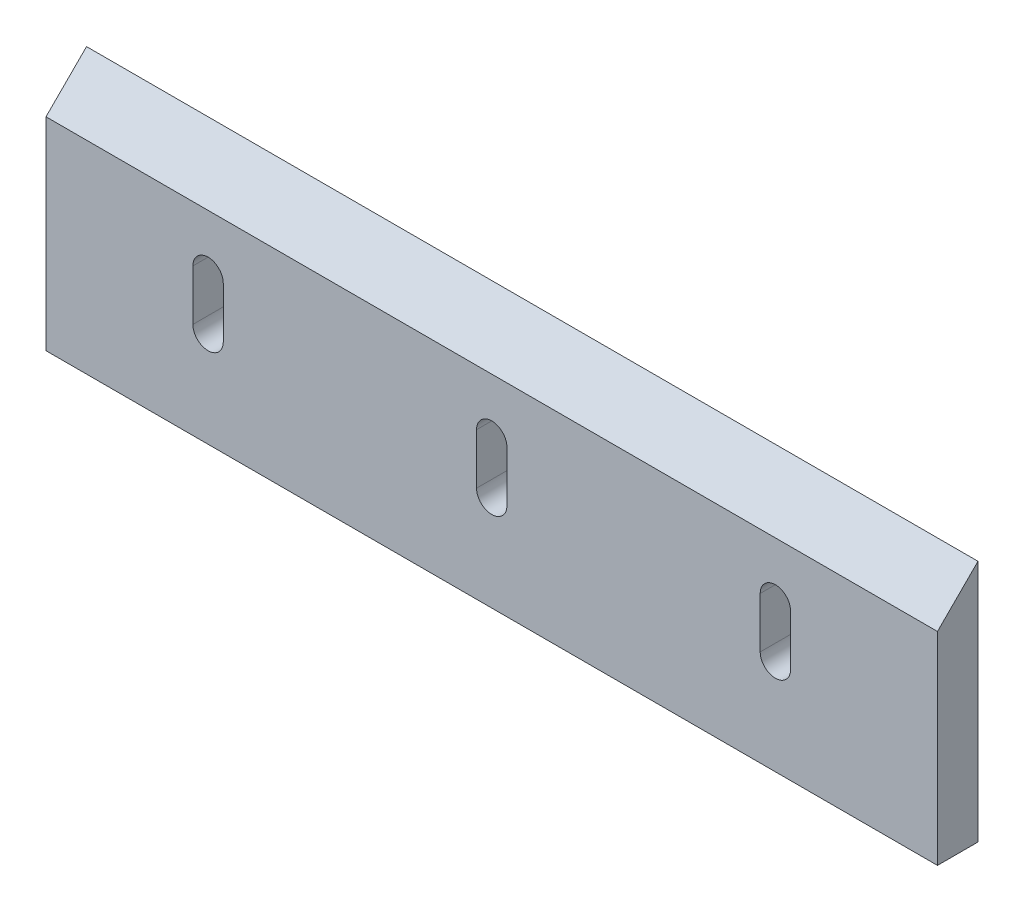
ISO-10303-21;
HEADER;
FILE_DESCRIPTION(('STEP AP214'),'2;1');
FILE_NAME('part.step','',(''),(''),'','','');
FILE_SCHEMA(('AUTOMOTIVE_DESIGN { 1 0 10303 214 1 1 1 1 }'));
ENDSEC;
DATA;
#1=APPLICATION_CONTEXT('core data for automotive mechanical design processes');
#2=APPLICATION_PROTOCOL_DEFINITION('international standard','automotive_design',2000,#1);
#3=PRODUCT_CONTEXT('',#1,'mechanical');
#4=PRODUCT('Part','Part','',(#3));
#5=PRODUCT_RELATED_PRODUCT_CATEGORY('part','',(#4));
#6=PRODUCT_DEFINITION_FORMATION('','',#4);
#7=PRODUCT_DEFINITION_CONTEXT('part definition',#1,'design');
#8=PRODUCT_DEFINITION('design','',#6,#7);
#9=PRODUCT_DEFINITION_SHAPE('','',#8);
#10=(LENGTH_UNIT() NAMED_UNIT(*) SI_UNIT(.MILLI.,.METRE.));
#11=(NAMED_UNIT(*) PLANE_ANGLE_UNIT() SI_UNIT($,.RADIAN.));
#12=(NAMED_UNIT(*) SI_UNIT($,.STERADIAN.) SOLID_ANGLE_UNIT());
#13=UNCERTAINTY_MEASURE_WITH_UNIT(LENGTH_MEASURE(1.E-05),#10,'distance_accuracy_value','');
#14=(GEOMETRIC_REPRESENTATION_CONTEXT(3) GLOBAL_UNCERTAINTY_ASSIGNED_CONTEXT((#13)) GLOBAL_UNIT_ASSIGNED_CONTEXT((#10,
#11,#12)) REPRESENTATION_CONTEXT('',''));
#15=CARTESIAN_POINT('',(0.,0.,0.));
#16=DIRECTION('',(0.,0.,1.));
#17=DIRECTION('',(1.,0.,0.));
#18=AXIS2_PLACEMENT_3D('',#15,#16,#17);
#19=CARTESIAN_POINT('',(139.7,-38.1,6.34999999999997));
#20=DIRECTION('',(-1.,0.,0.));
#21=DIRECTION('',(0.,0.,1.));
#22=AXIS2_PLACEMENT_3D('',#19,#20,#21);
#23=PLANE('',#22);
#24=DIRECTION('',(0.,1.,0.));
#25=VECTOR('',#24,1.);
#26=CARTESIAN_POINT('',(139.7,-38.0999999999999,-6.35000000000008));
#27=LINE('',#26,#25);
#28=CARTESIAN_POINT('',(139.7,-38.0999999999999,-6.35000000000008));
#29=VERTEX_POINT('',#28);
#30=CARTESIAN_POINT('',(139.7,38.1,-6.35000000000008));
#31=VERTEX_POINT('',#30);
#32=EDGE_CURVE('E260',#29,#31,#27,.T.);
#33=ORIENTED_EDGE('',*,*,#32,.T.);
#34=DIRECTION('',(0.,0.707106781186546,-0.707106781186549));
#35=VECTOR('',#34,1.);
#36=CARTESIAN_POINT('',(139.7,38.1,-6.35000000000008));
#37=LINE('',#36,#35);
#38=CARTESIAN_POINT('',(139.7,25.4000000000001,6.34999999999997));
#39=VERTEX_POINT('',#38);
#40=EDGE_CURVE('E253',#39,#31,#37,.T.);
#41=ORIENTED_EDGE('',*,*,#40,.F.);
#42=DIRECTION('',(0.,1.,0.));
#43=VECTOR('',#42,1.);
#44=CARTESIAN_POINT('',(139.7,-38.1,6.34999999999997));
#45=LINE('',#44,#43);
#46=CARTESIAN_POINT('',(139.7,-38.1,6.34999999999997));
#47=VERTEX_POINT('',#46);
#48=EDGE_CURVE('E261',#47,#39,#45,.T.);
#49=ORIENTED_EDGE('',*,*,#48,.F.);
#50=DIRECTION('',(0.,0.,-1.));
#51=VECTOR('',#50,1.);
#52=CARTESIAN_POINT('',(139.7,-38.1,6.34999999999997));
#53=LINE('',#52,#51);
#54=EDGE_CURVE('E269',#47,#29,#53,.T.);
#55=ORIENTED_EDGE('',*,*,#54,.T.);
#56=EDGE_LOOP('',(#33,#41,#49,#55));
#57=FACE_BOUND('',#56,.T.);
#58=ADVANCED_FACE('F34',(#57),#23,.F.);
#59=CARTESIAN_POINT('',(-139.7,-38.1,6.35000000000008));
#60=DIRECTION('',(1.,0.,0.));
#61=DIRECTION('',(0.,0.,-1.));
#62=AXIS2_PLACEMENT_3D('',#59,#60,#61);
#63=PLANE('',#62);
#64=DIRECTION('',(0.,-1.,0.));
#65=VECTOR('',#64,1.);
#66=CARTESIAN_POINT('',(-139.7,-38.1,6.35000000000008));
#67=LINE('',#66,#65);
#68=CARTESIAN_POINT('',(-139.7,25.4000000000001,6.35000000000008));
#69=VERTEX_POINT('',#68);
#70=CARTESIAN_POINT('',(-139.7,-38.1,6.35000000000008));
#71=VERTEX_POINT('',#70);
#72=EDGE_CURVE('E264',#69,#71,#67,.T.);
#73=ORIENTED_EDGE('',*,*,#72,.F.);
#74=DIRECTION('',(0.,0.707106781186546,-0.707106781186549));
#75=VECTOR('',#74,1.);
#76=CARTESIAN_POINT('',(-139.7,38.1000000000001,-6.34999999999997));
#77=LINE('',#76,#75);
#78=CARTESIAN_POINT('',(-139.7,38.1000000000001,-6.34999999999997));
#79=VERTEX_POINT('',#78);
#80=EDGE_CURVE('E254',#69,#79,#77,.T.);
#81=ORIENTED_EDGE('',*,*,#80,.T.);
#82=DIRECTION('',(0.,-1.,0.));
#83=VECTOR('',#82,1.);
#84=CARTESIAN_POINT('',(-139.7,-38.0999999999999,-6.34999999999997));
#85=LINE('',#84,#83);
#86=CARTESIAN_POINT('',(-139.7,-38.0999999999999,-6.34999999999997));
#87=VERTEX_POINT('',#86);
#88=EDGE_CURVE('E274',#79,#87,#85,.T.);
#89=ORIENTED_EDGE('',*,*,#88,.T.);
#90=DIRECTION('',(0.,0.,-1.));
#91=VECTOR('',#90,1.);
#92=CARTESIAN_POINT('',(-139.7,-38.1,6.35000000000008));
#93=LINE('',#92,#91);
#94=EDGE_CURVE('E156',#71,#87,#93,.T.);
#95=ORIENTED_EDGE('',*,*,#94,.F.);
#96=EDGE_LOOP('',(#73,#81,#89,#95));
#97=FACE_BOUND('',#96,.T.);
#98=ADVANCED_FACE('F307',(#97),#63,.F.);
#99=CARTESIAN_POINT('',(-139.7,-38.1,6.35000000000008));
#100=DIRECTION('',(0.,1.,0.));
#101=DIRECTION('',(0.,0.,1.));
#102=AXIS2_PLACEMENT_3D('',#99,#100,#101);
#103=PLANE('',#102);
#104=DIRECTION('',(1.,0.,0.));
#105=VECTOR('',#104,1.);
#106=CARTESIAN_POINT('',(-139.7,-38.0999999999999,-6.34999999999997));
#107=LINE('',#106,#105);
#108=EDGE_CURVE('E265',#87,#29,#107,.T.);
#109=ORIENTED_EDGE('',*,*,#108,.T.);
#110=ORIENTED_EDGE('',*,*,#54,.F.);
#111=DIRECTION('',(1.,0.,0.));
#112=VECTOR('',#111,1.);
#113=CARTESIAN_POINT('',(-139.7,-38.1,6.35000000000008));
#114=LINE('',#113,#112);
#115=EDGE_CURVE('E267',#71,#47,#114,.T.);
#116=ORIENTED_EDGE('',*,*,#115,.F.);
#117=ORIENTED_EDGE('',*,*,#94,.T.);
#118=EDGE_LOOP('',(#109,#110,#116,#117));
#119=FACE_BOUND('',#118,.T.);
#120=ADVANCED_FACE('F289',(#119),#103,.F.);
#121=CARTESIAN_POINT('',(1.11022302462516E-13,0.,6.34999999999997));
#122=DIRECTION('',(0.,0.,-1.));
#123=DIRECTION('',(-1.,0.,0.));
#124=AXIS2_PLACEMENT_3D('',#121,#122,#123);
#125=PLANE('',#124);
#126=DIRECTION('',(0.,-1.,0.));
#127=VECTOR('',#126,1.);
#128=CARTESIAN_POINT('',(-84.1374999999999,0.,6.34999999999997));
#129=LINE('',#128,#127);
#130=CARTESIAN_POINT('',(-84.1375,7.93749999999877,6.35000000000008));
#131=VERTEX_POINT('',#130);
#132=CARTESIAN_POINT('',(-84.1375,-7.93750000000126,6.34999999999997));
#133=VERTEX_POINT('',#132);
#134=EDGE_CURVE('E247',#131,#133,#129,.T.);
#135=ORIENTED_EDGE('',*,*,#134,.T.);
#136=CARTESIAN_POINT('',(-88.9,-7.93750000000126,6.35000000000008));
#137=DIRECTION('',(0.,0.,-1.));
#138=DIRECTION('',(-1.,0.,0.));
#139=AXIS2_PLACEMENT_3D('',#136,#137,#138);
#140=CIRCLE('',#139,4.7625);
#141=CARTESIAN_POINT('',(-93.6625,-7.93750000000126,6.35000000000008));
#142=VERTEX_POINT('',#141);
#143=EDGE_CURVE('E215',#133,#142,#140,.T.);
#144=ORIENTED_EDGE('',*,*,#143,.T.);
#145=DIRECTION('',(0.,1.,0.));
#146=VECTOR('',#145,1.);
#147=CARTESIAN_POINT('',(-93.6624999999999,0.,6.34999999999997));
#148=LINE('',#147,#146);
#149=CARTESIAN_POINT('',(-93.6625,7.93749999999877,6.35000000000008));
#150=VERTEX_POINT('',#149);
#151=EDGE_CURVE('E250',#142,#150,#148,.T.);
#152=ORIENTED_EDGE('',*,*,#151,.T.);
#153=CARTESIAN_POINT('',(-88.9,7.93749999999877,6.35000000000019));
#154=DIRECTION('',(0.,0.,-1.));
#155=DIRECTION('',(-1.,0.,0.));
#156=AXIS2_PLACEMENT_3D('',#153,#154,#155);
#157=CIRCLE('',#156,4.7625);
#158=EDGE_CURVE('E207',#150,#131,#157,.T.);
#159=ORIENTED_EDGE('',*,*,#158,.T.);
#160=EDGE_LOOP('',(#135,#144,#152,#159));
#161=FACE_BOUND('',#160,.T.);
#162=DIRECTION('',(0.,-1.,0.));
#163=VECTOR('',#162,1.);
#164=CARTESIAN_POINT('',(93.6624999999999,0.,6.35000000000019));
#165=LINE('',#164,#163);
#166=CARTESIAN_POINT('',(93.6624999999999,7.93749999999999,6.35000000000008));
#167=VERTEX_POINT('',#166);
#168=CARTESIAN_POINT('',(93.6624999999999,-7.93749999999999,6.35000000000008));
#169=VERTEX_POINT('',#168);
#170=EDGE_CURVE('E235',#167,#169,#165,.T.);
#171=ORIENTED_EDGE('',*,*,#170,.T.);
#172=CARTESIAN_POINT('',(88.8999999999999,-7.93749999999999,6.35000000000008));
#173=DIRECTION('',(0.,0.,-1.));
#174=DIRECTION('',(-1.,0.,0.));
#175=AXIS2_PLACEMENT_3D('',#172,#173,#174);
#176=CIRCLE('',#175,4.7625);
#177=CARTESIAN_POINT('',(84.1374999999999,-7.93749999999999,6.35000000000008));
#178=VERTEX_POINT('',#177);
#179=EDGE_CURVE('E244',#169,#178,#176,.T.);
#180=ORIENTED_EDGE('',*,*,#179,.T.);
#181=DIRECTION('',(0.,1.,0.));
#182=VECTOR('',#181,1.);
#183=CARTESIAN_POINT('',(84.1374999999999,0.,6.35000000000008));
#184=LINE('',#183,#182);
#185=CARTESIAN_POINT('',(84.1374999999999,7.93749999999999,6.35000000000019));
#186=VERTEX_POINT('',#185);
#187=EDGE_CURVE('E241',#178,#186,#184,.T.);
#188=ORIENTED_EDGE('',*,*,#187,.T.);
#189=CARTESIAN_POINT('',(88.8999999999999,7.93749999999999,6.35000000000019));
#190=DIRECTION('',(0.,0.,-1.));
#191=DIRECTION('',(-1.,0.,0.));
#192=AXIS2_PLACEMENT_3D('',#189,#190,#191);
#193=CIRCLE('',#192,4.7625);
#194=EDGE_CURVE('E238',#186,#167,#193,.T.);
#195=ORIENTED_EDGE('',*,*,#194,.T.);
#196=EDGE_LOOP('',(#171,#180,#188,#195));
#197=FACE_BOUND('',#196,.T.);
#198=DIRECTION('',(0.,-1.,0.));
#199=VECTOR('',#198,1.);
#200=CARTESIAN_POINT('',(4.76250000000011,0.,6.34999999999997));
#201=LINE('',#200,#199);
#202=CARTESIAN_POINT('',(4.7625,7.93749999999938,6.34999999999997));
#203=VERTEX_POINT('',#202);
#204=CARTESIAN_POINT('',(4.7625,-7.9375000000006,6.35000000000008));
#205=VERTEX_POINT('',#204);
#206=EDGE_CURVE('E222',#203,#205,#201,.T.);
#207=ORIENTED_EDGE('',*,*,#206,.T.);
#208=CARTESIAN_POINT('',(0.,-7.9375000000006,6.34999999999997));
#209=DIRECTION('',(0.,0.,-1.));
#210=DIRECTION('',(-1.,0.,0.));
#211=AXIS2_PLACEMENT_3D('',#208,#209,#210);
#212=CIRCLE('',#211,4.7625);
#213=CARTESIAN_POINT('',(-4.7625,-7.9375000000006,6.34999999999997));
#214=VERTEX_POINT('',#213);
#215=EDGE_CURVE('E164',#205,#214,#212,.T.);
#216=ORIENTED_EDGE('',*,*,#215,.T.);
#217=DIRECTION('',(0.,1.,0.));
#218=VECTOR('',#217,1.);
#219=CARTESIAN_POINT('',(-4.76249999999989,0.,6.34999999999997));
#220=LINE('',#219,#218);
#221=CARTESIAN_POINT('',(-4.7625,7.93749999999938,6.34999999999997));
#222=VERTEX_POINT('',#221);
#223=EDGE_CURVE('E231',#214,#222,#220,.T.);
#224=ORIENTED_EDGE('',*,*,#223,.T.);
#225=CARTESIAN_POINT('',(0.,7.93749999999938,6.34999999999997));
#226=DIRECTION('',(0.,0.,-1.));
#227=DIRECTION('',(-1.,0.,0.));
#228=AXIS2_PLACEMENT_3D('',#225,#226,#227);
#229=CIRCLE('',#228,4.7625);
#230=EDGE_CURVE('E228',#222,#203,#229,.T.);
#231=ORIENTED_EDGE('',*,*,#230,.T.);
#232=EDGE_LOOP('',(#207,#216,#224,#231));
#233=FACE_BOUND('',#232,.T.);
#234=ORIENTED_EDGE('',*,*,#48,.T.);
#235=DIRECTION('',(1.,0.,0.));
#236=VECTOR('',#235,1.);
#237=CARTESIAN_POINT('',(-139.7,25.4000000000001,6.35000000000008));
#238=LINE('',#237,#236);
#239=EDGE_CURVE('E257',#69,#39,#238,.T.);
#240=ORIENTED_EDGE('',*,*,#239,.F.);
#241=ORIENTED_EDGE('',*,*,#72,.T.);
#242=ORIENTED_EDGE('',*,*,#115,.T.);
#243=EDGE_LOOP('',(#234,#240,#241,#242));
#244=FACE_BOUND('',#243,.T.);
#245=ADVANCED_FACE('F286',(#161,#197,#233,#244),#125,.F.);
#246=CARTESIAN_POINT('',(-1.11022302462516E-13,1.11022302462516E-13,-6.35000000000008));
#247=DIRECTION('',(0.,0.,-1.));
#248=DIRECTION('',(-1.,0.,0.));
#249=AXIS2_PLACEMENT_3D('',#246,#247,#248);
#250=PLANE('',#249);
#251=CARTESIAN_POINT('',(-88.9,-7.93750000000114,-6.34999999999997));
#252=DIRECTION('',(0.,0.,-1.));
#253=DIRECTION('',(-1.,0.,0.));
#254=AXIS2_PLACEMENT_3D('',#251,#252,#253);
#255=CIRCLE('',#254,4.7625);
#256=CARTESIAN_POINT('',(-84.1375,-7.93750000000114,-6.35000000000008));
#257=VERTEX_POINT('',#256);
#258=CARTESIAN_POINT('',(-93.6625,-7.93750000000114,-6.34999999999997));
#259=VERTEX_POINT('',#258);
#260=EDGE_CURVE('E11',#257,#259,#255,.T.);
#261=ORIENTED_EDGE('',*,*,#260,.F.);
#262=DIRECTION('',(0.,-1.,0.));
#263=VECTOR('',#262,1.);
#264=CARTESIAN_POINT('',(-84.1375000000001,1.17961196366423E-13,-6.35000000000008));
#265=LINE('',#264,#263);
#266=CARTESIAN_POINT('',(-84.1375,7.93749999999882,-6.35000000000008));
#267=VERTEX_POINT('',#266);
#268=EDGE_CURVE('E185',#267,#257,#265,.T.);
#269=ORIENTED_EDGE('',*,*,#268,.F.);
#270=CARTESIAN_POINT('',(-88.9,7.93749999999882,-6.34999999999997));
#271=DIRECTION('',(0.,0.,-1.));
#272=DIRECTION('',(-1.,0.,0.));
#273=AXIS2_PLACEMENT_3D('',#270,#271,#272);
#274=CIRCLE('',#273,4.7625);
#275=CARTESIAN_POINT('',(-93.6625,7.93749999999882,-6.34999999999997));
#276=VERTEX_POINT('',#275);
#277=EDGE_CURVE('E187',#276,#267,#274,.T.);
#278=ORIENTED_EDGE('',*,*,#277,.F.);
#279=DIRECTION('',(0.,1.,0.));
#280=VECTOR('',#279,1.);
#281=CARTESIAN_POINT('',(-93.6625000000001,1.17961196366423E-13,-6.35000000000008));
#282=LINE('',#281,#280);
#283=EDGE_CURVE('E41',#259,#276,#282,.T.);
#284=ORIENTED_EDGE('',*,*,#283,.F.);
#285=EDGE_LOOP('',(#261,#269,#278,#284));
#286=FACE_BOUND('',#285,.T.);
#287=CARTESIAN_POINT('',(88.9,-7.93749999999992,-6.34999999999997));
#288=DIRECTION('',(0.,0.,-1.));
#289=DIRECTION('',(-1.,0.,0.));
#290=AXIS2_PLACEMENT_3D('',#287,#288,#289);
#291=CIRCLE('',#290,4.7625);
#292=CARTESIAN_POINT('',(93.6625,-7.93749999999993,-6.34999999999997));
#293=VERTEX_POINT('',#292);
#294=CARTESIAN_POINT('',(84.1375,-7.93749999999992,-6.34999999999986));
#295=VERTEX_POINT('',#294);
#296=EDGE_CURVE('E183',#293,#295,#291,.T.);
#297=ORIENTED_EDGE('',*,*,#296,.F.);
#298=DIRECTION('',(0.,-1.,0.));
#299=VECTOR('',#298,1.);
#300=CARTESIAN_POINT('',(93.6625,1.11022302462516E-13,-6.34999999999997));
#301=LINE('',#300,#299);
#302=CARTESIAN_POINT('',(93.6625,7.9375000000001,-6.34999999999986));
#303=VERTEX_POINT('',#302);
#304=EDGE_CURVE('E172',#303,#293,#301,.T.);
#305=ORIENTED_EDGE('',*,*,#304,.F.);
#306=CARTESIAN_POINT('',(88.9,7.9375000000001,-6.34999999999986));
#307=DIRECTION('',(0.,0.,-1.));
#308=DIRECTION('',(-1.,0.,0.));
#309=AXIS2_PLACEMENT_3D('',#306,#307,#308);
#310=CIRCLE('',#309,4.7625);
#311=CARTESIAN_POINT('',(84.1375,7.9375000000001,-6.34999999999974));
#312=VERTEX_POINT('',#311);
#313=EDGE_CURVE('E174',#312,#303,#310,.T.);
#314=ORIENTED_EDGE('',*,*,#313,.F.);
#315=DIRECTION('',(0.,1.,0.));
#316=VECTOR('',#315,1.);
#317=CARTESIAN_POINT('',(84.1375,1.17961196366423E-13,-6.34999999999986));
#318=LINE('',#317,#316);
#319=EDGE_CURVE('E181',#295,#312,#318,.T.);
#320=ORIENTED_EDGE('',*,*,#319,.F.);
#321=EDGE_LOOP('',(#297,#305,#314,#320));
#322=FACE_BOUND('',#321,.T.);
#323=CARTESIAN_POINT('',(0.,-7.93750000000054,-6.34999999999997));
#324=DIRECTION('',(0.,0.,-1.));
#325=DIRECTION('',(-1.,0.,0.));
#326=AXIS2_PLACEMENT_3D('',#323,#324,#325);
#327=CIRCLE('',#326,4.7625);
#328=CARTESIAN_POINT('',(4.7625,-7.93750000000053,-6.34999999999997));
#329=VERTEX_POINT('',#328);
#330=CARTESIAN_POINT('',(-4.7625,-7.93750000000054,-6.34999999999997));
#331=VERTEX_POINT('',#330);
#332=EDGE_CURVE('E161',#329,#331,#327,.T.);
#333=ORIENTED_EDGE('',*,*,#332,.F.);
#334=DIRECTION('',(0.,-1.,0.));
#335=VECTOR('',#334,1.);
#336=CARTESIAN_POINT('',(4.76249999999989,1.17961196366423E-13,-6.35000000000019));
#337=LINE('',#336,#335);
#338=CARTESIAN_POINT('',(4.7625,7.93749999999949,-6.35000000000008));
#339=VERTEX_POINT('',#338);
#340=EDGE_CURVE('E144',#339,#329,#337,.T.);
#341=ORIENTED_EDGE('',*,*,#340,.F.);
#342=CARTESIAN_POINT('',(0.,7.93749999999949,-6.35000000000008));
#343=DIRECTION('',(0.,0.,-1.));
#344=DIRECTION('',(-1.,0.,0.));
#345=AXIS2_PLACEMENT_3D('',#342,#343,#344);
#346=CIRCLE('',#345,4.7625);
#347=CARTESIAN_POINT('',(-4.7625,7.93749999999949,-6.35000000000008));
#348=VERTEX_POINT('',#347);
#349=EDGE_CURVE('E155',#348,#339,#346,.T.);
#350=ORIENTED_EDGE('',*,*,#349,.F.);
#351=DIRECTION('',(0.,1.,0.));
#352=VECTOR('',#351,1.);
#353=CARTESIAN_POINT('',(-4.76250000000011,1.11022302462516E-13,-6.35000000000008));
#354=LINE('',#353,#352);
#355=EDGE_CURVE('E171',#331,#348,#354,.T.);
#356=ORIENTED_EDGE('',*,*,#355,.F.);
#357=EDGE_LOOP('',(#333,#341,#350,#356));
#358=FACE_BOUND('',#357,.T.);
#359=ORIENTED_EDGE('',*,*,#32,.F.);
#360=ORIENTED_EDGE('',*,*,#108,.F.);
#361=ORIENTED_EDGE('',*,*,#88,.F.);
#362=DIRECTION('',(-1.,0.,0.));
#363=VECTOR('',#362,1.);
#364=CARTESIAN_POINT('',(-139.7,38.1000000000001,-6.34999999999997));
#365=LINE('',#364,#363);
#366=EDGE_CURVE('E272',#31,#79,#365,.T.);
#367=ORIENTED_EDGE('',*,*,#366,.F.);
#368=EDGE_LOOP('',(#359,#360,#361,#367));
#369=FACE_BOUND('',#368,.T.);
#370=ADVANCED_FACE('F169',(#286,#322,#358,#369),#250,.T.);
#371=CARTESIAN_POINT('',(-139.7,38.1000000000001,-6.34999999999997));
#372=DIRECTION('',(0.,-0.707106781186549,-0.707106781186546));
#373=DIRECTION('',(0.,0.707106781186546,-0.707106781186549));
#374=AXIS2_PLACEMENT_3D('',#371,#372,#373);
#375=PLANE('',#374);
#376=ORIENTED_EDGE('',*,*,#40,.T.);
#377=ORIENTED_EDGE('',*,*,#366,.T.);
#378=ORIENTED_EDGE('',*,*,#80,.F.);
#379=ORIENTED_EDGE('',*,*,#239,.T.);
#380=EDGE_LOOP('',(#376,#377,#378,#379));
#381=FACE_BOUND('',#380,.T.);
#382=ADVANCED_FACE('F302',(#381),#375,.F.);
#383=CARTESIAN_POINT('',(0.,-7.93750000000054,-38.1));
#384=DIRECTION('',(0.,0.,1.));
#385=DIRECTION('',(1.,0.,0.));
#386=AXIS2_PLACEMENT_3D('',#383,#384,#385);
#387=CYLINDRICAL_SURFACE('',#386,4.7625);
#388=DIRECTION('',(0.,0.,1.));
#389=VECTOR('',#388,1.);
#390=CARTESIAN_POINT('',(4.7625,-7.93750000000053,-38.1));
#391=LINE('',#390,#389);
#392=EDGE_CURVE('E147',#329,#205,#391,.T.);
#393=ORIENTED_EDGE('',*,*,#392,.F.);
#394=ORIENTED_EDGE('',*,*,#332,.T.);
#395=DIRECTION('',(0.,0.,1.));
#396=VECTOR('',#395,1.);
#397=CARTESIAN_POINT('',(-4.7625,-7.93750000000054,-38.0999999999999));
#398=LINE('',#397,#396);
#399=EDGE_CURVE('E220',#331,#214,#398,.T.);
#400=ORIENTED_EDGE('',*,*,#399,.T.);
#401=ORIENTED_EDGE('',*,*,#215,.F.);
#402=EDGE_LOOP('',(#393,#394,#400,#401));
#403=FACE_BOUND('',#402,.T.);
#404=ADVANCED_FACE('F159',(#403),#387,.F.);
#405=CARTESIAN_POINT('',(-4.7625,-7.93750000000054,-38.0999999999999));
#406=DIRECTION('',(-1.,0.,0.));
#407=DIRECTION('',(0.,0.,1.));
#408=AXIS2_PLACEMENT_3D('',#405,#406,#407);
#409=PLANE('',#408);
#410=ORIENTED_EDGE('',*,*,#399,.F.);
#411=ORIENTED_EDGE('',*,*,#355,.T.);
#412=DIRECTION('',(0.,0.,1.));
#413=VECTOR('',#412,1.);
#414=CARTESIAN_POINT('',(-4.7625,7.93749999999949,-38.1));
#415=LINE('',#414,#413);
#416=EDGE_CURVE('E223',#348,#222,#415,.T.);
#417=ORIENTED_EDGE('',*,*,#416,.T.);
#418=ORIENTED_EDGE('',*,*,#223,.F.);
#419=EDGE_LOOP('',(#410,#411,#417,#418));
#420=FACE_BOUND('',#419,.T.);
#421=ADVANCED_FACE('F284',(#420),#409,.F.);
#422=CARTESIAN_POINT('',(0.,7.93749999999949,-38.1));
#423=DIRECTION('',(0.,0.,1.));
#424=DIRECTION('',(1.,0.,0.));
#425=AXIS2_PLACEMENT_3D('',#422,#423,#424);
#426=CYLINDRICAL_SURFACE('',#425,4.7625);
#427=ORIENTED_EDGE('',*,*,#416,.F.);
#428=ORIENTED_EDGE('',*,*,#349,.T.);
#429=DIRECTION('',(0.,0.,1.));
#430=VECTOR('',#429,1.);
#431=CARTESIAN_POINT('',(4.7625,7.93749999999949,-38.1));
#432=LINE('',#431,#430);
#433=EDGE_CURVE('E150',#339,#203,#432,.T.);
#434=ORIENTED_EDGE('',*,*,#433,.T.);
#435=ORIENTED_EDGE('',*,*,#230,.F.);
#436=EDGE_LOOP('',(#427,#428,#434,#435));
#437=FACE_BOUND('',#436,.T.);
#438=ADVANCED_FACE('F282',(#437),#426,.F.);
#439=CARTESIAN_POINT('',(4.7625,-7.93750000000053,-38.1));
#440=DIRECTION('',(1.,0.,0.));
#441=DIRECTION('',(0.,0.,-1.));
#442=AXIS2_PLACEMENT_3D('',#439,#440,#441);
#443=PLANE('',#442);
#444=ORIENTED_EDGE('',*,*,#433,.F.);
#445=ORIENTED_EDGE('',*,*,#340,.T.);
#446=ORIENTED_EDGE('',*,*,#392,.T.);
#447=ORIENTED_EDGE('',*,*,#206,.F.);
#448=EDGE_LOOP('',(#444,#445,#446,#447));
#449=FACE_BOUND('',#448,.T.);
#450=ADVANCED_FACE('F146',(#449),#443,.F.);
#451=CARTESIAN_POINT('',(88.9,-7.93749999999992,-38.0999999999999));
#452=DIRECTION('',(0.,0.,1.));
#453=DIRECTION('',(1.,0.,0.));
#454=AXIS2_PLACEMENT_3D('',#451,#452,#453);
#455=CYLINDRICAL_SURFACE('',#454,4.7625);
#456=DIRECTION('',(0.,0.,1.));
#457=VECTOR('',#456,1.);
#458=CARTESIAN_POINT('',(93.6625,-7.93749999999993,-38.1));
#459=LINE('',#458,#457);
#460=EDGE_CURVE('E56',#293,#169,#459,.T.);
#461=ORIENTED_EDGE('',*,*,#460,.F.);
#462=ORIENTED_EDGE('',*,*,#296,.T.);
#463=DIRECTION('',(0.,0.,1.));
#464=VECTOR('',#463,1.);
#465=CARTESIAN_POINT('',(84.1375,-7.93749999999992,-38.0999999999998));
#466=LINE('',#465,#464);
#467=EDGE_CURVE('E166',#295,#178,#466,.T.);
#468=ORIENTED_EDGE('',*,*,#467,.T.);
#469=ORIENTED_EDGE('',*,*,#179,.F.);
#470=EDGE_LOOP('',(#461,#462,#468,#469));
#471=FACE_BOUND('',#470,.T.);
#472=ADVANCED_FACE('F364',(#471),#455,.F.);
#473=CARTESIAN_POINT('',(84.1375,-7.93749999999992,-38.0999999999998));
#474=DIRECTION('',(-1.,0.,0.));
#475=DIRECTION('',(0.,0.,1.));
#476=AXIS2_PLACEMENT_3D('',#473,#474,#475);
#477=PLANE('',#476);
#478=ORIENTED_EDGE('',*,*,#467,.F.);
#479=ORIENTED_EDGE('',*,*,#319,.T.);
#480=DIRECTION('',(0.,0.,1.));
#481=VECTOR('',#480,1.);
#482=CARTESIAN_POINT('',(84.1375,7.9375000000001,-38.0999999999999));
#483=LINE('',#482,#481);
#484=EDGE_CURVE('E423',#312,#186,#483,.T.);
#485=ORIENTED_EDGE('',*,*,#484,.T.);
#486=ORIENTED_EDGE('',*,*,#187,.F.);
#487=EDGE_LOOP('',(#478,#479,#485,#486));
#488=FACE_BOUND('',#487,.T.);
#489=ADVANCED_FACE('F371',(#488),#477,.F.);
#490=CARTESIAN_POINT('',(88.9,7.9375000000001,-38.0999999999999));
#491=DIRECTION('',(0.,0.,1.));
#492=DIRECTION('',(1.,0.,0.));
#493=AXIS2_PLACEMENT_3D('',#490,#491,#492);
#494=CYLINDRICAL_SURFACE('',#493,4.7625);
#495=ORIENTED_EDGE('',*,*,#484,.F.);
#496=ORIENTED_EDGE('',*,*,#313,.T.);
#497=DIRECTION('',(0.,0.,1.));
#498=VECTOR('',#497,1.);
#499=CARTESIAN_POINT('',(93.6625,7.9375000000001,-38.0999999999999));
#500=LINE('',#499,#498);
#501=EDGE_CURVE('E421',#303,#167,#500,.T.);
#502=ORIENTED_EDGE('',*,*,#501,.T.);
#503=ORIENTED_EDGE('',*,*,#194,.F.);
#504=EDGE_LOOP('',(#495,#496,#502,#503));
#505=FACE_BOUND('',#504,.T.);
#506=ADVANCED_FACE('F379',(#505),#494,.F.);
#507=CARTESIAN_POINT('',(93.6625,-7.93749999999993,-38.1));
#508=DIRECTION('',(1.,0.,0.));
#509=DIRECTION('',(0.,0.,-1.));
#510=AXIS2_PLACEMENT_3D('',#507,#508,#509);
#511=PLANE('',#510);
#512=ORIENTED_EDGE('',*,*,#501,.F.);
#513=ORIENTED_EDGE('',*,*,#304,.T.);
#514=ORIENTED_EDGE('',*,*,#460,.T.);
#515=ORIENTED_EDGE('',*,*,#170,.F.);
#516=EDGE_LOOP('',(#512,#513,#514,#515));
#517=FACE_BOUND('',#516,.T.);
#518=ADVANCED_FACE('F387',(#517),#511,.F.);
#519=CARTESIAN_POINT('',(-88.9,-7.93750000000114,-38.1));
#520=DIRECTION('',(0.,0.,1.));
#521=DIRECTION('',(1.,0.,0.));
#522=AXIS2_PLACEMENT_3D('',#519,#520,#521);
#523=CYLINDRICAL_SURFACE('',#522,4.7625);
#524=DIRECTION('',(0.,0.,1.));
#525=VECTOR('',#524,1.);
#526=CARTESIAN_POINT('',(-84.1375,-7.93750000000114,-38.1));
#527=LINE('',#526,#525);
#528=EDGE_CURVE('E48',#257,#133,#527,.T.);
#529=ORIENTED_EDGE('',*,*,#528,.F.);
#530=ORIENTED_EDGE('',*,*,#260,.T.);
#531=DIRECTION('',(0.,0.,1.));
#532=VECTOR('',#531,1.);
#533=CARTESIAN_POINT('',(-93.6625,-7.93750000000114,-38.1));
#534=LINE('',#533,#532);
#535=EDGE_CURVE('E198',#259,#142,#534,.T.);
#536=ORIENTED_EDGE('',*,*,#535,.T.);
#537=ORIENTED_EDGE('',*,*,#143,.F.);
#538=EDGE_LOOP('',(#529,#530,#536,#537));
#539=FACE_BOUND('',#538,.T.);
#540=ADVANCED_FACE('F213',(#539),#523,.F.);
#541=CARTESIAN_POINT('',(-93.6625,-7.93750000000114,-38.1));
#542=DIRECTION('',(-1.,0.,0.));
#543=DIRECTION('',(0.,0.,1.));
#544=AXIS2_PLACEMENT_3D('',#541,#542,#543);
#545=PLANE('',#544);
#546=ORIENTED_EDGE('',*,*,#535,.F.);
#547=ORIENTED_EDGE('',*,*,#283,.T.);
#548=DIRECTION('',(0.,0.,1.));
#549=VECTOR('',#548,1.);
#550=CARTESIAN_POINT('',(-93.6625,7.93749999999882,-38.0999999999999));
#551=LINE('',#550,#549);
#552=EDGE_CURVE('E195',#276,#150,#551,.T.);
#553=ORIENTED_EDGE('',*,*,#552,.T.);
#554=ORIENTED_EDGE('',*,*,#151,.F.);
#555=EDGE_LOOP('',(#546,#547,#553,#554));
#556=FACE_BOUND('',#555,.T.);
#557=ADVANCED_FACE('F194',(#556),#545,.F.);
#558=CARTESIAN_POINT('',(-88.9,7.93749999999882,-38.0999999999999));
#559=DIRECTION('',(0.,0.,1.));
#560=DIRECTION('',(1.,0.,0.));
#561=AXIS2_PLACEMENT_3D('',#558,#559,#560);
#562=CYLINDRICAL_SURFACE('',#561,4.7625);
#563=ORIENTED_EDGE('',*,*,#552,.F.);
#564=ORIENTED_EDGE('',*,*,#277,.T.);
#565=DIRECTION('',(0.,0.,1.));
#566=VECTOR('',#565,1.);
#567=CARTESIAN_POINT('',(-84.1375,7.93749999999882,-38.1));
#568=LINE('',#567,#566);
#569=EDGE_CURVE('E208',#267,#131,#568,.T.);
#570=ORIENTED_EDGE('',*,*,#569,.T.);
#571=ORIENTED_EDGE('',*,*,#158,.F.);
#572=EDGE_LOOP('',(#563,#564,#570,#571));
#573=FACE_BOUND('',#572,.T.);
#574=ADVANCED_FACE('F203',(#573),#562,.F.);
#575=CARTESIAN_POINT('',(-84.1375,-7.93750000000114,-38.1));
#576=DIRECTION('',(1.,0.,0.));
#577=DIRECTION('',(0.,0.,-1.));
#578=AXIS2_PLACEMENT_3D('',#575,#576,#577);
#579=PLANE('',#578);
#580=ORIENTED_EDGE('',*,*,#569,.F.);
#581=ORIENTED_EDGE('',*,*,#268,.T.);
#582=ORIENTED_EDGE('',*,*,#528,.T.);
#583=ORIENTED_EDGE('',*,*,#134,.F.);
#584=EDGE_LOOP('',(#580,#581,#582,#583));
#585=FACE_BOUND('',#584,.T.);
#586=ADVANCED_FACE('F211',(#585),#579,.F.);
#587=CLOSED_SHELL('',(#58,#98,#120,#245,#370,#382,#404,#421,#438,#450,#472,#489,#506,#518,#540,
#557,#574,#586));
#588=MANIFOLD_SOLID_BREP('B2',#587);
#589=ADVANCED_BREP_SHAPE_REPRESENTATION('',(#18,#588),#14);
#590=SHAPE_DEFINITION_REPRESENTATION(#9,#589);
ENDSEC;
END-ISO-10303-21;
